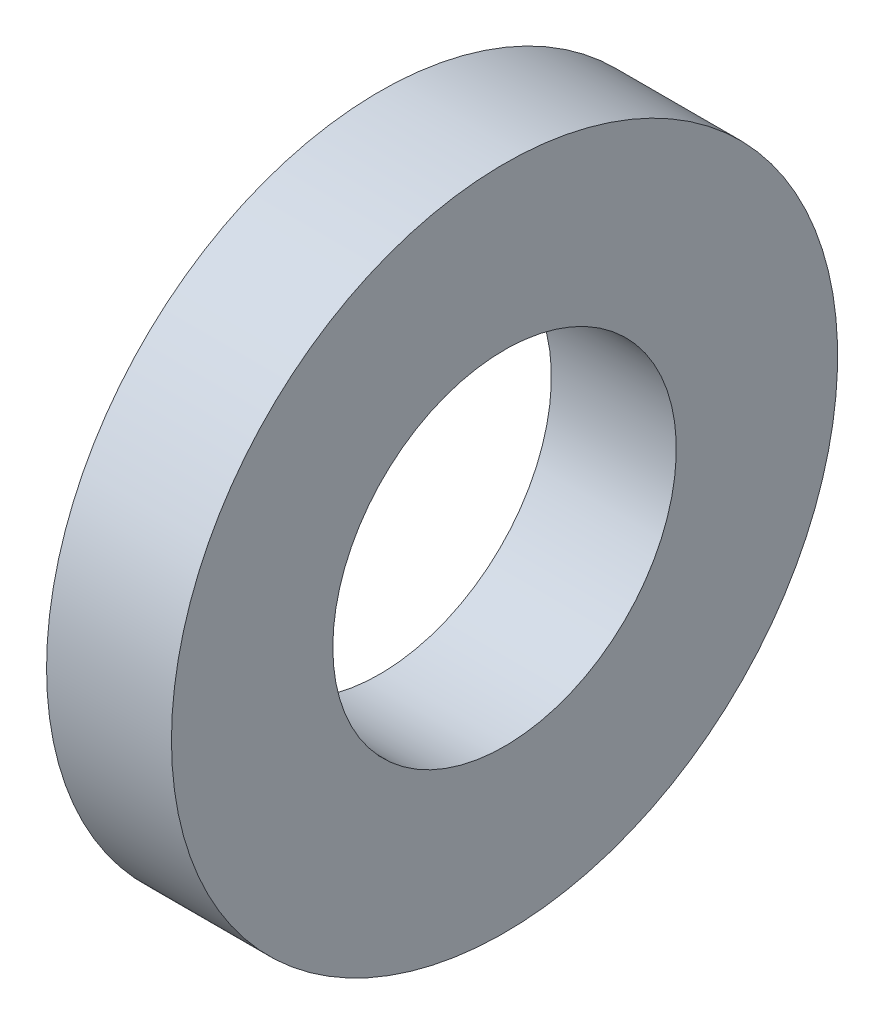
ISO-10303-21;
HEADER;
FILE_DESCRIPTION(('STEP AP214'),'2;1');
FILE_NAME('part.step','',(''),(''),'','','');
FILE_SCHEMA(('AUTOMOTIVE_DESIGN { 1 0 10303 214 1 1 1 1 }'));
ENDSEC;
DATA;
#1=APPLICATION_CONTEXT('core data for automotive mechanical design processes');
#2=APPLICATION_PROTOCOL_DEFINITION('international standard','automotive_design',2000,#1);
#3=PRODUCT_CONTEXT('',#1,'mechanical');
#4=PRODUCT('Part','Part','',(#3));
#5=PRODUCT_RELATED_PRODUCT_CATEGORY('part','',(#4));
#6=PRODUCT_DEFINITION_FORMATION('','',#4);
#7=PRODUCT_DEFINITION_CONTEXT('part definition',#1,'design');
#8=PRODUCT_DEFINITION('design','',#6,#7);
#9=PRODUCT_DEFINITION_SHAPE('','',#8);
#10=(LENGTH_UNIT() NAMED_UNIT(*) SI_UNIT(.MILLI.,.METRE.));
#11=(NAMED_UNIT(*) PLANE_ANGLE_UNIT() SI_UNIT($,.RADIAN.));
#12=(NAMED_UNIT(*) SI_UNIT($,.STERADIAN.) SOLID_ANGLE_UNIT());
#13=UNCERTAINTY_MEASURE_WITH_UNIT(LENGTH_MEASURE(1.E-05),#10,'distance_accuracy_value','');
#14=(GEOMETRIC_REPRESENTATION_CONTEXT(3) GLOBAL_UNCERTAINTY_ASSIGNED_CONTEXT((#13)) GLOBAL_UNIT_ASSIGNED_CONTEXT((#10,
#11,#12)) REPRESENTATION_CONTEXT('',''));
#15=CARTESIAN_POINT('',(0.,0.,0.));
#16=DIRECTION('',(0.,0.,1.));
#17=DIRECTION('',(1.,0.,0.));
#18=AXIS2_PLACEMENT_3D('',#15,#16,#17);
#19=CARTESIAN_POINT('',(134.5,3.2,0.));
#20=DIRECTION('',(1.,0.,0.));
#21=DIRECTION('',(0.,0.,-1.));
#22=AXIS2_PLACEMENT_3D('',#19,#20,#21);
#23=PLANE('',#22);
#24=CARTESIAN_POINT('',(134.5,0.,0.));
#25=DIRECTION('',(-1.,0.,0.));
#26=DIRECTION('',(0.,0.,1.));
#27=AXIS2_PLACEMENT_3D('',#24,#25,#26);
#28=CIRCLE('',#27,1.65);
#29=CARTESIAN_POINT('',(134.5,0.,1.65));
#30=VERTEX_POINT('',#29);
#31=EDGE_CURVE('E10',#30,#30,#28,.T.);
#32=ORIENTED_EDGE('',*,*,#31,.F.);
#33=EDGE_LOOP('',(#32));
#34=FACE_BOUND('',#33,.T.);
#35=CARTESIAN_POINT('',(134.5,0.,0.));
#36=DIRECTION('',(-1.,0.,0.));
#37=DIRECTION('',(0.,0.,1.));
#38=AXIS2_PLACEMENT_3D('',#35,#36,#37);
#39=CIRCLE('',#38,3.2);
#40=CARTESIAN_POINT('',(134.5,0.,3.2));
#41=VERTEX_POINT('',#40);
#42=EDGE_CURVE('E45',#41,#41,#39,.T.);
#43=ORIENTED_EDGE('',*,*,#42,.T.);
#44=EDGE_LOOP('',(#43));
#45=FACE_BOUND('',#44,.T.);
#46=ADVANCED_FACE('F31',(#34,#45),#23,.F.);
#47=CARTESIAN_POINT('',(-110.,0.,0.));
#48=DIRECTION('',(-1.,0.,0.));
#49=DIRECTION('',(0.,0.,1.));
#50=AXIS2_PLACEMENT_3D('',#47,#48,#49);
#51=CYLINDRICAL_SURFACE('',#50,1.65);
#52=CARTESIAN_POINT('',(135.7,0.,0.));
#53=DIRECTION('',(-1.,0.,0.));
#54=DIRECTION('',(0.,0.,1.));
#55=AXIS2_PLACEMENT_3D('',#52,#53,#54);
#56=CIRCLE('',#55,1.65);
#57=CARTESIAN_POINT('',(135.7,0.,1.65));
#58=VERTEX_POINT('',#57);
#59=EDGE_CURVE('E37',#58,#58,#56,.T.);
#60=ORIENTED_EDGE('',*,*,#59,.F.);
#61=EDGE_LOOP('',(#60));
#62=FACE_BOUND('',#61,.T.);
#63=ORIENTED_EDGE('',*,*,#31,.T.);
#64=EDGE_LOOP('',(#63));
#65=FACE_BOUND('',#64,.T.);
#66=ADVANCED_FACE('F60',(#62,#65),#51,.F.);
#67=CARTESIAN_POINT('',(135.7,1.65,0.));
#68=DIRECTION('',(-1.,0.,0.));
#69=DIRECTION('',(0.,0.,1.));
#70=AXIS2_PLACEMENT_3D('',#67,#68,#69);
#71=PLANE('',#70);
#72=CARTESIAN_POINT('',(135.7,0.,0.));
#73=DIRECTION('',(-1.,0.,0.));
#74=DIRECTION('',(0.,0.,1.));
#75=AXIS2_PLACEMENT_3D('',#72,#73,#74);
#76=CIRCLE('',#75,3.2);
#77=CARTESIAN_POINT('',(135.7,0.,3.2));
#78=VERTEX_POINT('',#77);
#79=EDGE_CURVE('E41',#78,#78,#76,.T.);
#80=ORIENTED_EDGE('',*,*,#79,.F.);
#81=EDGE_LOOP('',(#80));
#82=FACE_BOUND('',#81,.T.);
#83=ORIENTED_EDGE('',*,*,#59,.T.);
#84=EDGE_LOOP('',(#83));
#85=FACE_BOUND('',#84,.T.);
#86=ADVANCED_FACE('F55',(#82,#85),#71,.F.);
#87=CARTESIAN_POINT('',(-110.,0.,0.));
#88=DIRECTION('',(-1.,0.,0.));
#89=DIRECTION('',(0.,0.,1.));
#90=AXIS2_PLACEMENT_3D('',#87,#88,#89);
#91=CYLINDRICAL_SURFACE('',#90,3.2);
#92=ORIENTED_EDGE('',*,*,#42,.F.);
#93=EDGE_LOOP('',(#92));
#94=FACE_BOUND('',#93,.T.);
#95=ORIENTED_EDGE('',*,*,#79,.T.);
#96=EDGE_LOOP('',(#95));
#97=FACE_BOUND('',#96,.T.);
#98=ADVANCED_FACE('F52',(#94,#97),#91,.T.);
#99=CLOSED_SHELL('',(#46,#66,#86,#98));
#100=MANIFOLD_SOLID_BREP('B2',#99);
#101=ADVANCED_BREP_SHAPE_REPRESENTATION('',(#18,#100),#14);
#102=SHAPE_DEFINITION_REPRESENTATION(#9,#101);
ENDSEC;
END-ISO-10303-21;
